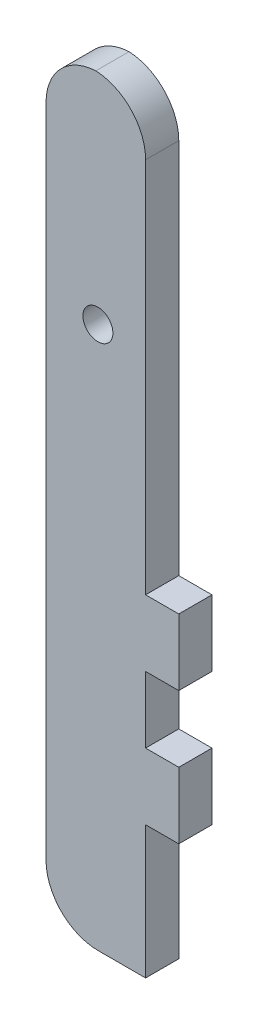
ISO-10303-21;
HEADER;
FILE_DESCRIPTION(('STEP AP214'),'2;1');
FILE_NAME('part.step','',(''),(''),'','','');
FILE_SCHEMA(('AUTOMOTIVE_DESIGN { 1 0 10303 214 1 1 1 1 }'));
ENDSEC;
DATA;
#1=APPLICATION_CONTEXT('core data for automotive mechanical design processes');
#2=APPLICATION_PROTOCOL_DEFINITION('international standard','automotive_design',2000,#1);
#3=PRODUCT_CONTEXT('',#1,'mechanical');
#4=PRODUCT('Part','Part','',(#3));
#5=PRODUCT_RELATED_PRODUCT_CATEGORY('part','',(#4));
#6=PRODUCT_DEFINITION_FORMATION('','',#4);
#7=PRODUCT_DEFINITION_CONTEXT('part definition',#1,'design');
#8=PRODUCT_DEFINITION('design','',#6,#7);
#9=PRODUCT_DEFINITION_SHAPE('','',#8);
#10=(LENGTH_UNIT() NAMED_UNIT(*) SI_UNIT(.MILLI.,.METRE.));
#11=(NAMED_UNIT(*) PLANE_ANGLE_UNIT() SI_UNIT($,.RADIAN.));
#12=(NAMED_UNIT(*) SI_UNIT($,.STERADIAN.) SOLID_ANGLE_UNIT());
#13=UNCERTAINTY_MEASURE_WITH_UNIT(LENGTH_MEASURE(1.E-05),#10,'distance_accuracy_value','');
#14=(GEOMETRIC_REPRESENTATION_CONTEXT(3) GLOBAL_UNCERTAINTY_ASSIGNED_CONTEXT((#13)) GLOBAL_UNIT_ASSIGNED_CONTEXT((#10,
#11,#12)) REPRESENTATION_CONTEXT('',''));
#15=CARTESIAN_POINT('',(0.,0.,0.));
#16=DIRECTION('',(0.,0.,1.));
#17=DIRECTION('',(1.,0.,0.));
#18=AXIS2_PLACEMENT_3D('',#15,#16,#17);
#19=CARTESIAN_POINT('',(-44.45,-44.45,6.35));
#20=DIRECTION('',(-1.,0.,0.));
#21=DIRECTION('',(0.,0.,1.));
#22=AXIS2_PLACEMENT_3D('',#19,#20,#21);
#23=PLANE('',#22);
#24=DIRECTION('',(0.,1.,0.));
#25=VECTOR('',#24,1.);
#26=CARTESIAN_POINT('',(-44.45,-44.45,0.));
#27=LINE('',#26,#25);
#28=CARTESIAN_POINT('',(-44.45,-44.45,0.));
#29=VERTEX_POINT('',#28);
#30=CARTESIAN_POINT('',(-44.45,-19.05,0.));
#31=VERTEX_POINT('',#30);
#32=EDGE_CURVE('E157',#29,#31,#27,.T.);
#33=ORIENTED_EDGE('',*,*,#32,.T.);
#34=DIRECTION('',(0.,0.,-1.));
#35=VECTOR('',#34,1.);
#36=CARTESIAN_POINT('',(-44.45,-19.05,6.35));
#37=LINE('',#36,#35);
#38=CARTESIAN_POINT('',(-44.45,-19.05,6.35));
#39=VERTEX_POINT('',#38);
#40=EDGE_CURVE('E138',#39,#31,#37,.T.);
#41=ORIENTED_EDGE('',*,*,#40,.F.);
#42=DIRECTION('',(0.,1.,0.));
#43=VECTOR('',#42,1.);
#44=CARTESIAN_POINT('',(-44.45,-44.45,6.35));
#45=LINE('',#44,#43);
#46=CARTESIAN_POINT('',(-44.45,-44.45,6.35));
#47=VERTEX_POINT('',#46);
#48=EDGE_CURVE('E144',#47,#39,#45,.T.);
#49=ORIENTED_EDGE('',*,*,#48,.F.);
#50=DIRECTION('',(0.,0.,-1.));
#51=VECTOR('',#50,1.);
#52=CARTESIAN_POINT('',(-44.45,-44.45,6.35));
#53=LINE('',#52,#51);
#54=EDGE_CURVE('E188',#47,#29,#53,.T.);
#55=ORIENTED_EDGE('',*,*,#54,.T.);
#56=EDGE_LOOP('',(#33,#41,#49,#55));
#57=FACE_BOUND('',#56,.T.);
#58=ADVANCED_FACE('F33',(#57),#23,.F.);
#59=CARTESIAN_POINT('',(-44.45,-19.05,6.35));
#60=DIRECTION('',(0.,1.,0.));
#61=DIRECTION('',(0.,0.,1.));
#62=AXIS2_PLACEMENT_3D('',#59,#60,#61);
#63=PLANE('',#62);
#64=DIRECTION('',(1.,0.,0.));
#65=VECTOR('',#64,1.);
#66=CARTESIAN_POINT('',(-44.45,-19.05,0.));
#67=LINE('',#66,#65);
#68=CARTESIAN_POINT('',(-38.1,-19.05,0.));
#69=VERTEX_POINT('',#68);
#70=EDGE_CURVE('E241',#31,#69,#67,.T.);
#71=ORIENTED_EDGE('',*,*,#70,.T.);
#72=DIRECTION('',(0.,0.,-1.));
#73=VECTOR('',#72,1.);
#74=CARTESIAN_POINT('',(-38.1,-19.05,6.35));
#75=LINE('',#74,#73);
#76=CARTESIAN_POINT('',(-38.1,-19.05,6.35));
#77=VERTEX_POINT('',#76);
#78=EDGE_CURVE('E141',#77,#69,#75,.T.);
#79=ORIENTED_EDGE('',*,*,#78,.F.);
#80=DIRECTION('',(1.,0.,0.));
#81=VECTOR('',#80,1.);
#82=CARTESIAN_POINT('',(-44.45,-19.05,6.35));
#83=LINE('',#82,#81);
#84=EDGE_CURVE('E134',#39,#77,#83,.T.);
#85=ORIENTED_EDGE('',*,*,#84,.F.);
#86=ORIENTED_EDGE('',*,*,#40,.T.);
#87=EDGE_LOOP('',(#71,#79,#85,#86));
#88=FACE_BOUND('',#87,.T.);
#89=ADVANCED_FACE('F136',(#88),#63,.F.);
#90=CARTESIAN_POINT('',(-38.1,-6.34999999999996,6.35));
#91=DIRECTION('',(-1.,0.,0.));
#92=DIRECTION('',(0.,0.,1.));
#93=AXIS2_PLACEMENT_3D('',#90,#91,#92);
#94=PLANE('',#93);
#95=DIRECTION('',(0.,1.,0.));
#96=VECTOR('',#95,1.);
#97=CARTESIAN_POINT('',(-38.1,-6.34999999999996,0.));
#98=LINE('',#97,#96);
#99=CARTESIAN_POINT('',(-38.1,-6.34999999999996,0.));
#100=VERTEX_POINT('',#99);
#101=EDGE_CURVE('E235',#69,#100,#98,.T.);
#102=ORIENTED_EDGE('',*,*,#101,.T.);
#103=DIRECTION('',(0.,0.,-1.));
#104=VECTOR('',#103,1.);
#105=CARTESIAN_POINT('',(-38.1,-6.34999999999996,6.35));
#106=LINE('',#105,#104);
#107=CARTESIAN_POINT('',(-38.1,-6.34999999999996,6.35));
#108=VERTEX_POINT('',#107);
#109=EDGE_CURVE('E163',#108,#100,#106,.T.);
#110=ORIENTED_EDGE('',*,*,#109,.F.);
#111=DIRECTION('',(0.,1.,0.));
#112=VECTOR('',#111,1.);
#113=CARTESIAN_POINT('',(-38.1,-6.34999999999996,6.35));
#114=LINE('',#113,#112);
#115=EDGE_CURVE('E143',#77,#108,#114,.T.);
#116=ORIENTED_EDGE('',*,*,#115,.F.);
#117=ORIENTED_EDGE('',*,*,#78,.T.);
#118=EDGE_LOOP('',(#102,#110,#116,#117));
#119=FACE_BOUND('',#118,.T.);
#120=ADVANCED_FACE('F269',(#119),#94,.F.);
#121=CARTESIAN_POINT('',(-44.45,-6.34999999999996,6.35));
#122=DIRECTION('',(0.,-1.,0.));
#123=DIRECTION('',(0.,0.,-1.));
#124=AXIS2_PLACEMENT_3D('',#121,#122,#123);
#125=PLANE('',#124);
#126=DIRECTION('',(-1.,0.,0.));
#127=VECTOR('',#126,1.);
#128=CARTESIAN_POINT('',(-44.45,-6.34999999999996,0.));
#129=LINE('',#128,#127);
#130=CARTESIAN_POINT('',(-44.45,-6.34999999999996,0.));
#131=VERTEX_POINT('',#130);
#132=EDGE_CURVE('E230',#100,#131,#129,.T.);
#133=ORIENTED_EDGE('',*,*,#132,.T.);
#134=DIRECTION('',(0.,0.,-1.));
#135=VECTOR('',#134,1.);
#136=CARTESIAN_POINT('',(-44.45,-6.34999999999996,6.35));
#137=LINE('',#136,#135);
#138=CARTESIAN_POINT('',(-44.45,-6.34999999999996,6.35));
#139=VERTEX_POINT('',#138);
#140=EDGE_CURVE('E221',#139,#131,#137,.T.);
#141=ORIENTED_EDGE('',*,*,#140,.F.);
#142=DIRECTION('',(-1.,0.,0.));
#143=VECTOR('',#142,1.);
#144=CARTESIAN_POINT('',(-44.45,-6.34999999999996,6.35));
#145=LINE('',#144,#143);
#146=EDGE_CURVE('E231',#108,#139,#145,.T.);
#147=ORIENTED_EDGE('',*,*,#146,.F.);
#148=ORIENTED_EDGE('',*,*,#109,.T.);
#149=EDGE_LOOP('',(#133,#141,#147,#148));
#150=FACE_BOUND('',#149,.T.);
#151=ADVANCED_FACE('F228',(#150),#125,.F.);
#152=CARTESIAN_POINT('',(-44.45,-6.34999999999996,6.35));
#153=DIRECTION('',(-1.,0.,0.));
#154=DIRECTION('',(0.,0.,1.));
#155=AXIS2_PLACEMENT_3D('',#152,#153,#154);
#156=PLANE('',#155);
#157=DIRECTION('',(0.,1.,0.));
#158=VECTOR('',#157,1.);
#159=CARTESIAN_POINT('',(-44.45,-6.34999999999996,0.));
#160=LINE('',#159,#158);
#161=CARTESIAN_POINT('',(-44.45,6.35000000000004,0.));
#162=VERTEX_POINT('',#161);
#163=EDGE_CURVE('E237',#131,#162,#160,.T.);
#164=ORIENTED_EDGE('',*,*,#163,.T.);
#165=DIRECTION('',(0.,0.,-1.));
#166=VECTOR('',#165,1.);
#167=CARTESIAN_POINT('',(-44.45,6.35000000000004,6.35));
#168=LINE('',#167,#166);
#169=CARTESIAN_POINT('',(-44.45,6.35000000000004,6.35));
#170=VERTEX_POINT('',#169);
#171=EDGE_CURVE('E218',#170,#162,#168,.T.);
#172=ORIENTED_EDGE('',*,*,#171,.F.);
#173=DIRECTION('',(0.,1.,0.));
#174=VECTOR('',#173,1.);
#175=CARTESIAN_POINT('',(-44.45,-6.34999999999996,6.35));
#176=LINE('',#175,#174);
#177=EDGE_CURVE('E271',#139,#170,#176,.T.);
#178=ORIENTED_EDGE('',*,*,#177,.F.);
#179=ORIENTED_EDGE('',*,*,#140,.T.);
#180=EDGE_LOOP('',(#164,#172,#178,#179));
#181=FACE_BOUND('',#180,.T.);
#182=ADVANCED_FACE('F286',(#181),#156,.F.);
#183=CARTESIAN_POINT('',(-44.45,6.35000000000004,6.35));
#184=DIRECTION('',(0.,1.,0.));
#185=DIRECTION('',(0.,0.,1.));
#186=AXIS2_PLACEMENT_3D('',#183,#184,#185);
#187=PLANE('',#186);
#188=DIRECTION('',(1.,0.,0.));
#189=VECTOR('',#188,1.);
#190=CARTESIAN_POINT('',(-44.45,6.35000000000004,0.));
#191=LINE('',#190,#189);
#192=CARTESIAN_POINT('',(-38.1,6.35000000000004,0.));
#193=VERTEX_POINT('',#192);
#194=EDGE_CURVE('E239',#162,#193,#191,.T.);
#195=ORIENTED_EDGE('',*,*,#194,.T.);
#196=DIRECTION('',(0.,0.,-1.));
#197=VECTOR('',#196,1.);
#198=CARTESIAN_POINT('',(-38.1,6.35000000000004,6.35));
#199=LINE('',#198,#197);
#200=CARTESIAN_POINT('',(-38.1,6.35000000000004,6.35));
#201=VERTEX_POINT('',#200);
#202=EDGE_CURVE('E215',#201,#193,#199,.T.);
#203=ORIENTED_EDGE('',*,*,#202,.F.);
#204=DIRECTION('',(1.,0.,0.));
#205=VECTOR('',#204,1.);
#206=CARTESIAN_POINT('',(-44.45,6.35000000000004,6.35));
#207=LINE('',#206,#205);
#208=EDGE_CURVE('E275',#170,#201,#207,.T.);
#209=ORIENTED_EDGE('',*,*,#208,.F.);
#210=ORIENTED_EDGE('',*,*,#171,.T.);
#211=EDGE_LOOP('',(#195,#203,#209,#210));
#212=FACE_BOUND('',#211,.T.);
#213=ADVANCED_FACE('F282',(#212),#187,.F.);
#214=CARTESIAN_POINT('',(-38.1,19.05,6.35));
#215=DIRECTION('',(-1.,0.,0.));
#216=DIRECTION('',(0.,0.,1.));
#217=AXIS2_PLACEMENT_3D('',#214,#215,#216);
#218=PLANE('',#217);
#219=DIRECTION('',(0.,1.,0.));
#220=VECTOR('',#219,1.);
#221=CARTESIAN_POINT('',(-38.1,19.05,0.));
#222=LINE('',#221,#220);
#223=CARTESIAN_POINT('',(-38.1,19.05,0.));
#224=VERTEX_POINT('',#223);
#225=EDGE_CURVE('E246',#193,#224,#222,.T.);
#226=ORIENTED_EDGE('',*,*,#225,.T.);
#227=DIRECTION('',(0.,0.,-1.));
#228=VECTOR('',#227,1.);
#229=CARTESIAN_POINT('',(-38.1,19.05,6.35));
#230=LINE('',#229,#228);
#231=CARTESIAN_POINT('',(-38.1,19.05,6.35));
#232=VERTEX_POINT('',#231);
#233=EDGE_CURVE('E212',#232,#224,#230,.T.);
#234=ORIENTED_EDGE('',*,*,#233,.F.);
#235=DIRECTION('',(0.,1.,0.));
#236=VECTOR('',#235,1.);
#237=CARTESIAN_POINT('',(-38.1,19.05,6.35));
#238=LINE('',#237,#236);
#239=EDGE_CURVE('E265',#201,#232,#238,.T.);
#240=ORIENTED_EDGE('',*,*,#239,.F.);
#241=ORIENTED_EDGE('',*,*,#202,.T.);
#242=EDGE_LOOP('',(#226,#234,#240,#241));
#243=FACE_BOUND('',#242,.T.);
#244=ADVANCED_FACE('F280',(#243),#218,.F.);
#245=CARTESIAN_POINT('',(-44.45,19.05,6.35));
#246=DIRECTION('',(0.,-1.,0.));
#247=DIRECTION('',(0.,0.,-1.));
#248=AXIS2_PLACEMENT_3D('',#245,#246,#247);
#249=PLANE('',#248);
#250=DIRECTION('',(-1.,0.,0.));
#251=VECTOR('',#250,1.);
#252=CARTESIAN_POINT('',(-44.45,19.05,0.));
#253=LINE('',#252,#251);
#254=CARTESIAN_POINT('',(-44.45,19.05,0.));
#255=VERTEX_POINT('',#254);
#256=EDGE_CURVE('E204',#224,#255,#253,.T.);
#257=ORIENTED_EDGE('',*,*,#256,.T.);
#258=DIRECTION('',(0.,0.,-1.));
#259=VECTOR('',#258,1.);
#260=CARTESIAN_POINT('',(-44.45,19.05,6.35));
#261=LINE('',#260,#259);
#262=CARTESIAN_POINT('',(-44.45,19.05,6.35));
#263=VERTEX_POINT('',#262);
#264=EDGE_CURVE('E209',#263,#255,#261,.T.);
#265=ORIENTED_EDGE('',*,*,#264,.F.);
#266=DIRECTION('',(-1.,0.,0.));
#267=VECTOR('',#266,1.);
#268=CARTESIAN_POINT('',(-44.45,19.05,6.35));
#269=LINE('',#268,#267);
#270=EDGE_CURVE('E262',#232,#263,#269,.T.);
#271=ORIENTED_EDGE('',*,*,#270,.F.);
#272=ORIENTED_EDGE('',*,*,#233,.T.);
#273=EDGE_LOOP('',(#257,#265,#271,#272));
#274=FACE_BOUND('',#273,.T.);
#275=ADVANCED_FACE('F250',(#274),#249,.F.);
#276=CARTESIAN_POINT('',(-44.45,19.05,6.35));
#277=DIRECTION('',(-1.,0.,0.));
#278=DIRECTION('',(0.,0.,1.));
#279=AXIS2_PLACEMENT_3D('',#276,#277,#278);
#280=PLANE('',#279);
#281=DIRECTION('',(0.,1.,0.));
#282=VECTOR('',#281,1.);
#283=CARTESIAN_POINT('',(-44.45,19.05,0.));
#284=LINE('',#283,#282);
#285=CARTESIAN_POINT('',(-44.45,91.1288859632156,0.));
#286=VERTEX_POINT('',#285);
#287=EDGE_CURVE('E200',#255,#286,#284,.T.);
#288=ORIENTED_EDGE('',*,*,#287,.T.);
#289=DIRECTION('',(0.,0.,-1.));
#290=VECTOR('',#289,1.);
#291=CARTESIAN_POINT('',(-44.45,91.1288859632157,6.35));
#292=LINE('',#291,#290);
#293=CARTESIAN_POINT('',(-44.45,91.1288859632156,6.35));
#294=VERTEX_POINT('',#293);
#295=EDGE_CURVE('E11',#286,#294,#292,.F.);
#296=ORIENTED_EDGE('',*,*,#295,.T.);
#297=DIRECTION('',(0.,1.,0.));
#298=VECTOR('',#297,1.);
#299=CARTESIAN_POINT('',(-44.45,19.05,6.35));
#300=LINE('',#299,#298);
#301=EDGE_CURVE('E258',#263,#294,#300,.T.);
#302=ORIENTED_EDGE('',*,*,#301,.F.);
#303=ORIENTED_EDGE('',*,*,#264,.T.);
#304=EDGE_LOOP('',(#288,#296,#302,#303));
#305=FACE_BOUND('',#304,.T.);
#306=ADVANCED_FACE('F257',(#305),#280,.F.);
#307=CARTESIAN_POINT('',(-63.5,-44.45,6.35));
#308=DIRECTION('',(1.,0.,0.));
#309=DIRECTION('',(0.,0.,-1.));
#310=AXIS2_PLACEMENT_3D('',#307,#308,#309);
#311=PLANE('',#310);
#312=DIRECTION('',(0.,-1.,0.));
#313=VECTOR('',#312,1.);
#314=CARTESIAN_POINT('',(-63.5,-44.45,0.));
#315=LINE('',#314,#313);
#316=CARTESIAN_POINT('',(-63.5,91.1288859632157,0.));
#317=VERTEX_POINT('',#316);
#318=CARTESIAN_POINT('',(-63.5,-34.45,0.));
#319=VERTEX_POINT('',#318);
#320=EDGE_CURVE('E195',#317,#319,#315,.T.);
#321=ORIENTED_EDGE('',*,*,#320,.T.);
#322=DIRECTION('',(0.,0.,-1.));
#323=VECTOR('',#322,1.);
#324=CARTESIAN_POINT('',(-63.5,-34.45,6.35));
#325=LINE('',#324,#323);
#326=CARTESIAN_POINT('',(-63.5,-34.45,6.35));
#327=VERTEX_POINT('',#326);
#328=EDGE_CURVE('E174',#319,#327,#325,.F.);
#329=ORIENTED_EDGE('',*,*,#328,.T.);
#330=DIRECTION('',(0.,-1.,0.));
#331=VECTOR('',#330,1.);
#332=CARTESIAN_POINT('',(-63.5,-44.45,6.35));
#333=LINE('',#332,#331);
#334=CARTESIAN_POINT('',(-63.5,91.1288859632157,6.35));
#335=VERTEX_POINT('',#334);
#336=EDGE_CURVE('E181',#335,#327,#333,.T.);
#337=ORIENTED_EDGE('',*,*,#336,.F.);
#338=DIRECTION('',(0.,0.,-1.));
#339=VECTOR('',#338,1.);
#340=CARTESIAN_POINT('',(-63.5,91.1288859632157,6.35));
#341=LINE('',#340,#339);
#342=EDGE_CURVE('E172',#335,#317,#341,.T.);
#343=ORIENTED_EDGE('',*,*,#342,.T.);
#344=EDGE_LOOP('',(#321,#329,#337,#343));
#345=FACE_BOUND('',#344,.T.);
#346=ADVANCED_FACE('F198',(#345),#311,.F.);
#347=CARTESIAN_POINT('',(-44.45,-44.45,6.35));
#348=DIRECTION('',(0.,1.,0.));
#349=DIRECTION('',(0.,0.,1.));
#350=AXIS2_PLACEMENT_3D('',#347,#348,#349);
#351=PLANE('',#350);
#352=DIRECTION('',(1.,0.,0.));
#353=VECTOR('',#352,1.);
#354=CARTESIAN_POINT('',(-44.45,-44.45,6.35));
#355=LINE('',#354,#353);
#356=CARTESIAN_POINT('',(-53.5,-44.45,6.35));
#357=VERTEX_POINT('',#356);
#358=EDGE_CURVE('E150',#357,#47,#355,.T.);
#359=ORIENTED_EDGE('',*,*,#358,.F.);
#360=DIRECTION('',(0.,0.,-1.));
#361=VECTOR('',#360,1.);
#362=CARTESIAN_POINT('',(-53.5,-44.45,6.35));
#363=LINE('',#362,#361);
#364=CARTESIAN_POINT('',(-53.5,-44.45,0.));
#365=VERTEX_POINT('',#364);
#366=EDGE_CURVE('E158',#357,#365,#363,.T.);
#367=ORIENTED_EDGE('',*,*,#366,.T.);
#368=DIRECTION('',(1.,0.,0.));
#369=VECTOR('',#368,1.);
#370=CARTESIAN_POINT('',(-44.45,-44.45,0.));
#371=LINE('',#370,#369);
#372=EDGE_CURVE('E154',#365,#29,#371,.T.);
#373=ORIENTED_EDGE('',*,*,#372,.T.);
#374=ORIENTED_EDGE('',*,*,#54,.F.);
#375=EDGE_LOOP('',(#359,#367,#373,#374));
#376=FACE_BOUND('',#375,.T.);
#377=ADVANCED_FACE('F186',(#376),#351,.F.);
#378=CARTESIAN_POINT('',(0.,0.,6.35));
#379=DIRECTION('',(0.,0.,-1.));
#380=DIRECTION('',(-1.,0.,0.));
#381=AXIS2_PLACEMENT_3D('',#378,#379,#380);
#382=PLANE('',#381);
#383=CARTESIAN_POINT('',(-53.5750000000001,59.2899417882053,6.35));
#384=DIRECTION('',(0.,0.,-1.));
#385=DIRECTION('',(-1.,0.,0.));
#386=AXIS2_PLACEMENT_3D('',#383,#384,#385);
#387=CIRCLE('',#386,2.8702);
#388=CARTESIAN_POINT('',(-56.4452,59.2899417882053,6.35));
#389=VERTEX_POINT('',#388);
#390=EDGE_CURVE('E315',#389,#389,#387,.T.);
#391=ORIENTED_EDGE('',*,*,#390,.T.);
#392=EDGE_LOOP('',(#391));
#393=FACE_BOUND('',#392,.T.);
#394=ORIENTED_EDGE('',*,*,#336,.T.);
#395=CARTESIAN_POINT('',(-53.5,-34.45,6.35));
#396=DIRECTION('',(0.,0.,-1.));
#397=DIRECTION('',(-1.,0.,0.));
#398=AXIS2_PLACEMENT_3D('',#395,#396,#397);
#399=CIRCLE('',#398,10.);
#400=EDGE_CURVE('E42',#327,#357,#399,.F.);
#401=ORIENTED_EDGE('',*,*,#400,.T.);
#402=ORIENTED_EDGE('',*,*,#358,.T.);
#403=ORIENTED_EDGE('',*,*,#48,.T.);
#404=ORIENTED_EDGE('',*,*,#84,.T.);
#405=ORIENTED_EDGE('',*,*,#115,.T.);
#406=ORIENTED_EDGE('',*,*,#146,.T.);
#407=ORIENTED_EDGE('',*,*,#177,.T.);
#408=ORIENTED_EDGE('',*,*,#208,.T.);
#409=ORIENTED_EDGE('',*,*,#239,.T.);
#410=ORIENTED_EDGE('',*,*,#270,.T.);
#411=ORIENTED_EDGE('',*,*,#301,.T.);
#412=CARTESIAN_POINT('',(-54.45,91.1288859632157,6.35));
#413=DIRECTION('',(0.,0.,-1.));
#414=DIRECTION('',(-1.,0.,0.));
#415=AXIS2_PLACEMENT_3D('',#412,#413,#414);
#416=CIRCLE('',#415,10.);
#417=CARTESIAN_POINT('',(-53.975,101.117598342697,6.35));
#418=VERTEX_POINT('',#417);
#419=EDGE_CURVE('E49',#294,#418,#416,.F.);
#420=ORIENTED_EDGE('',*,*,#419,.T.);
#421=CARTESIAN_POINT('',(-53.5,91.1288859632157,6.35));
#422=DIRECTION('',(0.,0.,-1.));
#423=DIRECTION('',(-1.,0.,0.));
#424=AXIS2_PLACEMENT_3D('',#421,#422,#423);
#425=CIRCLE('',#424,10.);
#426=EDGE_CURVE('E176',#418,#335,#425,.F.);
#427=ORIENTED_EDGE('',*,*,#426,.T.);
#428=EDGE_LOOP('',(#394,#401,#402,#403,#404,#405,#406,#407,#408,#409,#410,#411,#420,#427));
#429=FACE_BOUND('',#428,.T.);
#430=ADVANCED_FACE('F148',(#393,#429),#382,.F.);
#431=CARTESIAN_POINT('',(0.,0.,0.));
#432=DIRECTION('',(0.,0.,-1.));
#433=DIRECTION('',(-1.,0.,0.));
#434=AXIS2_PLACEMENT_3D('',#431,#432,#433);
#435=PLANE('',#434);
#436=CARTESIAN_POINT('',(-53.5750000000001,59.2899417882053,0.));
#437=DIRECTION('',(0.,0.,-1.));
#438=DIRECTION('',(-1.,0.,0.));
#439=AXIS2_PLACEMENT_3D('',#436,#437,#438);
#440=CIRCLE('',#439,2.8702);
#441=CARTESIAN_POINT('',(-56.4452,59.2899417882053,0.));
#442=VERTEX_POINT('',#441);
#443=EDGE_CURVE('E317',#442,#442,#440,.T.);
#444=ORIENTED_EDGE('',*,*,#443,.F.);
#445=EDGE_LOOP('',(#444));
#446=FACE_BOUND('',#445,.T.);
#447=ORIENTED_EDGE('',*,*,#372,.F.);
#448=CARTESIAN_POINT('',(-53.5,-34.45,0.));
#449=DIRECTION('',(0.,0.,-1.));
#450=DIRECTION('',(-1.,0.,0.));
#451=AXIS2_PLACEMENT_3D('',#448,#449,#450);
#452=CIRCLE('',#451,10.);
#453=EDGE_CURVE('E170',#365,#319,#452,.T.);
#454=ORIENTED_EDGE('',*,*,#453,.T.);
#455=ORIENTED_EDGE('',*,*,#320,.F.);
#456=CARTESIAN_POINT('',(-53.5,91.1288859632157,0.));
#457=DIRECTION('',(0.,0.,-1.));
#458=DIRECTION('',(-1.,0.,0.));
#459=AXIS2_PLACEMENT_3D('',#456,#457,#458);
#460=CIRCLE('',#459,10.);
#461=CARTESIAN_POINT('',(-53.975,101.117598342697,0.));
#462=VERTEX_POINT('',#461);
#463=EDGE_CURVE('E161',#317,#462,#460,.T.);
#464=ORIENTED_EDGE('',*,*,#463,.T.);
#465=CARTESIAN_POINT('',(-54.45,91.1288859632157,0.));
#466=DIRECTION('',(0.,0.,-1.));
#467=DIRECTION('',(-1.,0.,0.));
#468=AXIS2_PLACEMENT_3D('',#465,#466,#467);
#469=CIRCLE('',#468,10.);
#470=EDGE_CURVE('E168',#462,#286,#469,.T.);
#471=ORIENTED_EDGE('',*,*,#470,.T.);
#472=ORIENTED_EDGE('',*,*,#287,.F.);
#473=ORIENTED_EDGE('',*,*,#256,.F.);
#474=ORIENTED_EDGE('',*,*,#225,.F.);
#475=ORIENTED_EDGE('',*,*,#194,.F.);
#476=ORIENTED_EDGE('',*,*,#163,.F.);
#477=ORIENTED_EDGE('',*,*,#132,.F.);
#478=ORIENTED_EDGE('',*,*,#101,.F.);
#479=ORIENTED_EDGE('',*,*,#70,.F.);
#480=ORIENTED_EDGE('',*,*,#32,.F.);
#481=EDGE_LOOP('',(#447,#454,#455,#464,#471,#472,#473,#474,#475,#476,#477,#478,#479,#480));
#482=FACE_BOUND('',#481,.T.);
#483=ADVANCED_FACE('F194',(#446,#482),#435,.T.);
#484=CARTESIAN_POINT('',(-53.5,-34.45,6.35));
#485=DIRECTION('',(0.,0.,-1.));
#486=DIRECTION('',(-1.,0.,0.));
#487=AXIS2_PLACEMENT_3D('',#484,#485,#486);
#488=CYLINDRICAL_SURFACE('',#487,10.);
#489=ORIENTED_EDGE('',*,*,#400,.F.);
#490=ORIENTED_EDGE('',*,*,#328,.F.);
#491=ORIENTED_EDGE('',*,*,#453,.F.);
#492=ORIENTED_EDGE('',*,*,#366,.F.);
#493=EDGE_LOOP('',(#489,#490,#491,#492));
#494=FACE_BOUND('',#493,.T.);
#495=ADVANCED_FACE('F190',(#494),#488,.T.);
#496=CARTESIAN_POINT('',(-53.5,91.1288859632157,6.35));
#497=DIRECTION('',(0.,0.,-1.));
#498=DIRECTION('',(-1.,0.,0.));
#499=AXIS2_PLACEMENT_3D('',#496,#497,#498);
#500=CYLINDRICAL_SURFACE('',#499,10.);
#501=ORIENTED_EDGE('',*,*,#342,.F.);
#502=ORIENTED_EDGE('',*,*,#426,.F.);
#503=DIRECTION('',(0.,0.,-1.));
#504=VECTOR('',#503,1.);
#505=CARTESIAN_POINT('',(-53.975,101.117598342697,3.175));
#506=LINE('',#505,#504);
#507=EDGE_CURVE('E37',#462,#418,#506,.F.);
#508=ORIENTED_EDGE('',*,*,#507,.F.);
#509=ORIENTED_EDGE('',*,*,#463,.F.);
#510=EDGE_LOOP('',(#501,#502,#508,#509));
#511=FACE_BOUND('',#510,.T.);
#512=ADVANCED_FACE('F35',(#511),#500,.T.);
#513=CARTESIAN_POINT('',(-54.45,91.1288859632157,6.35));
#514=DIRECTION('',(0.,0.,-1.));
#515=DIRECTION('',(-1.,0.,0.));
#516=AXIS2_PLACEMENT_3D('',#513,#514,#515);
#517=CYLINDRICAL_SURFACE('',#516,10.);
#518=ORIENTED_EDGE('',*,*,#419,.F.);
#519=ORIENTED_EDGE('',*,*,#295,.F.);
#520=ORIENTED_EDGE('',*,*,#470,.F.);
#521=ORIENTED_EDGE('',*,*,#507,.T.);
#522=EDGE_LOOP('',(#518,#519,#520,#521));
#523=FACE_BOUND('',#522,.T.);
#524=ADVANCED_FACE('F261',(#523),#517,.T.);
#525=CARTESIAN_POINT('',(-53.5750000000001,59.2899417882053,6.35));
#526=DIRECTION('',(0.,0.,-1.));
#527=DIRECTION('',(-1.,0.,0.));
#528=AXIS2_PLACEMENT_3D('',#525,#526,#527);
#529=CYLINDRICAL_SURFACE('',#528,2.8702);
#530=ORIENTED_EDGE('',*,*,#390,.F.);
#531=EDGE_LOOP('',(#530));
#532=FACE_BOUND('',#531,.T.);
#533=ORIENTED_EDGE('',*,*,#443,.T.);
#534=EDGE_LOOP('',(#533));
#535=FACE_BOUND('',#534,.T.);
#536=ADVANCED_FACE('F305',(#532,#535),#529,.F.);
#537=CLOSED_SHELL('',(#58,#89,#120,#151,#182,#213,#244,#275,#306,#346,#377,#430,#483,#495,#512,
#524,#536));
#538=MANIFOLD_SOLID_BREP('B2',#537);
#539=ADVANCED_BREP_SHAPE_REPRESENTATION('',(#18,#538),#14);
#540=SHAPE_DEFINITION_REPRESENTATION(#9,#539);
ENDSEC;
END-ISO-10303-21;
